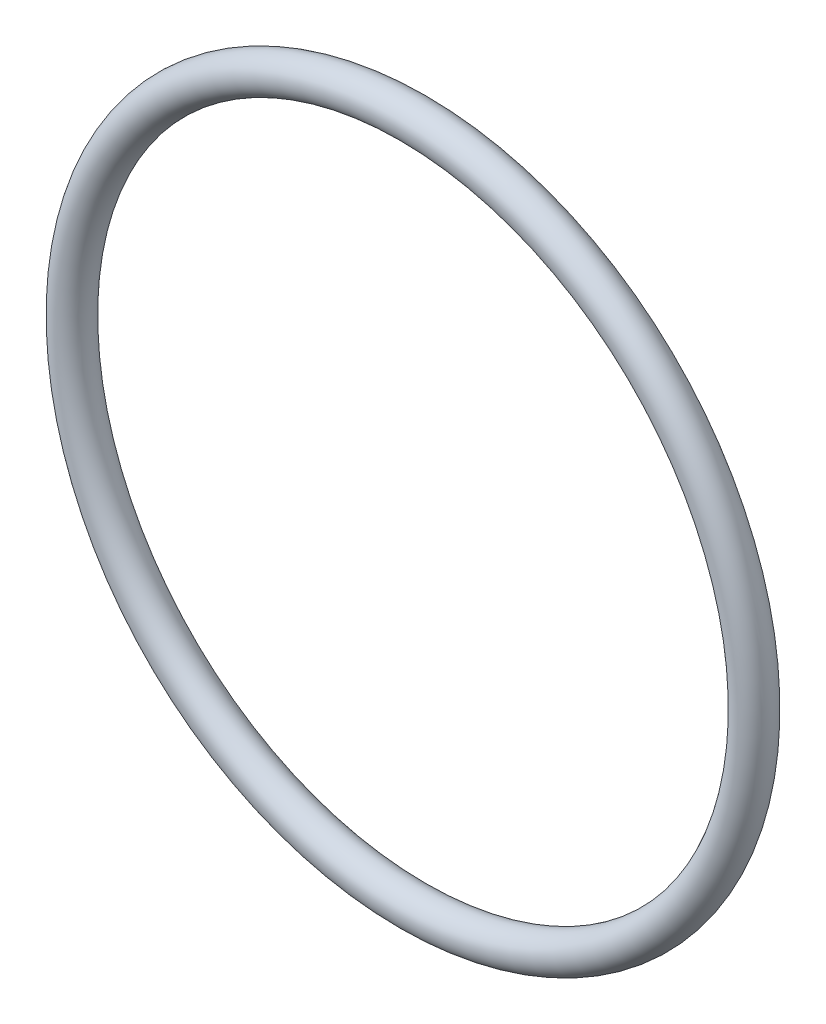
ISO-10303-21;
HEADER;
FILE_DESCRIPTION(('STEP AP214'),'2;1');
FILE_NAME('part.step','',(''),(''),'','','');
FILE_SCHEMA(('AUTOMOTIVE_DESIGN { 1 0 10303 214 1 1 1 1 }'));
ENDSEC;
DATA;
#1=APPLICATION_CONTEXT('core data for automotive mechanical design processes');
#2=APPLICATION_PROTOCOL_DEFINITION('international standard','automotive_design',2000,#1);
#3=PRODUCT_CONTEXT('',#1,'mechanical');
#4=PRODUCT('Part','Part','',(#3));
#5=PRODUCT_RELATED_PRODUCT_CATEGORY('part','',(#4));
#6=PRODUCT_DEFINITION_FORMATION('','',#4);
#7=PRODUCT_DEFINITION_CONTEXT('part definition',#1,'design');
#8=PRODUCT_DEFINITION('design','',#6,#7);
#9=PRODUCT_DEFINITION_SHAPE('','',#8);
#10=(LENGTH_UNIT() NAMED_UNIT(*) SI_UNIT(.MILLI.,.METRE.));
#11=(NAMED_UNIT(*) PLANE_ANGLE_UNIT() SI_UNIT($,.RADIAN.));
#12=(NAMED_UNIT(*) SI_UNIT($,.STERADIAN.) SOLID_ANGLE_UNIT());
#13=UNCERTAINTY_MEASURE_WITH_UNIT(LENGTH_MEASURE(1.E-05),#10,'distance_accuracy_value','');
#14=(GEOMETRIC_REPRESENTATION_CONTEXT(3) GLOBAL_UNCERTAINTY_ASSIGNED_CONTEXT((#13)) GLOBAL_UNIT_ASSIGNED_CONTEXT((#10,
#11,#12)) REPRESENTATION_CONTEXT('',''));
#15=CARTESIAN_POINT('',(0.,0.,0.));
#16=DIRECTION('',(0.,0.,1.));
#17=DIRECTION('',(1.,0.,0.));
#18=AXIS2_PLACEMENT_3D('',#15,#16,#17);
#19=CARTESIAN_POINT('',(0.,0.,0.));
#20=DIRECTION('',(0.,0.,1.));
#21=DIRECTION('',(0.,-1.,0.));
#22=AXIS2_PLACEMENT_3D('',#19,#20,#21);
#23=TOROIDAL_SURFACE('',#22,16.6243,0.889000000000001);
#24=CARTESIAN_POINT('',(0.,-17.5133,0.));
#25=VERTEX_POINT('',#24);
#26=VERTEX_LOOP('',#25);
#27=FACE_BOUND('',#26,.T.);
#28=ADVANCED_FACE('F39',(#27),#23,.T.);
#29=CLOSED_SHELL('',(#28));
#30=MANIFOLD_SOLID_BREP('B2',#29);
#31=ADVANCED_BREP_SHAPE_REPRESENTATION('',(#18,#30),#14);
#32=SHAPE_DEFINITION_REPRESENTATION(#9,#31);
ENDSEC;
END-ISO-10303-21;
